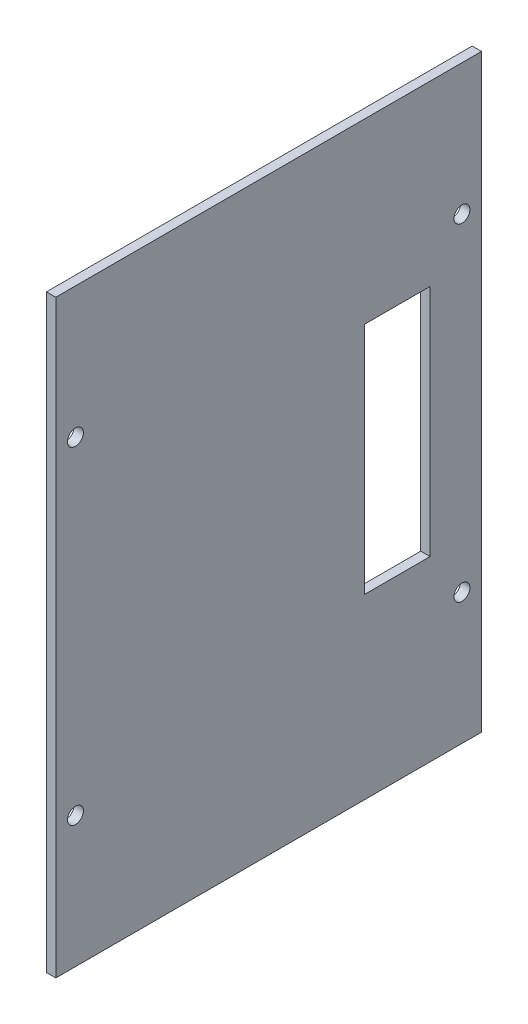
ISO-10303-21;
HEADER;
FILE_DESCRIPTION(('STEP AP214'),'2;1');
FILE_NAME('part.step','',(''),(''),'','','');
FILE_SCHEMA(('AUTOMOTIVE_DESIGN { 1 0 10303 214 1 1 1 1 }'));
ENDSEC;
DATA;
#1=APPLICATION_CONTEXT('core data for automotive mechanical design processes');
#2=APPLICATION_PROTOCOL_DEFINITION('international standard','automotive_design',2000,#1);
#3=PRODUCT_CONTEXT('',#1,'mechanical');
#4=PRODUCT('Part','Part','',(#3));
#5=PRODUCT_RELATED_PRODUCT_CATEGORY('part','',(#4));
#6=PRODUCT_DEFINITION_FORMATION('','',#4);
#7=PRODUCT_DEFINITION_CONTEXT('part definition',#1,'design');
#8=PRODUCT_DEFINITION('design','',#6,#7);
#9=PRODUCT_DEFINITION_SHAPE('','',#8);
#10=(LENGTH_UNIT() NAMED_UNIT(*) SI_UNIT(.MILLI.,.METRE.));
#11=(NAMED_UNIT(*) PLANE_ANGLE_UNIT() SI_UNIT($,.RADIAN.));
#12=(NAMED_UNIT(*) SI_UNIT($,.STERADIAN.) SOLID_ANGLE_UNIT());
#13=UNCERTAINTY_MEASURE_WITH_UNIT(LENGTH_MEASURE(1.E-05),#10,'distance_accuracy_value','');
#14=(GEOMETRIC_REPRESENTATION_CONTEXT(3) GLOBAL_UNCERTAINTY_ASSIGNED_CONTEXT((#13)) GLOBAL_UNIT_ASSIGNED_CONTEXT((#10,
#11,#12)) REPRESENTATION_CONTEXT('',''));
#15=CARTESIAN_POINT('',(0.,0.,0.));
#16=DIRECTION('',(0.,0.,1.));
#17=DIRECTION('',(1.,0.,0.));
#18=AXIS2_PLACEMENT_3D('',#15,#16,#17);
#19=CARTESIAN_POINT('',(-16.,-63.,0.));
#20=DIRECTION('',(1.,0.,0.));
#21=DIRECTION('',(0.,1.,0.));
#22=AXIS2_PLACEMENT_3D('',#19,#20,#21);
#23=PLANE('',#22);
#24=CARTESIAN_POINT('',(-16.,-35.,86.8));
#25=DIRECTION('',(-1.,0.,0.));
#26=DIRECTION('',(0.,0.,1.));
#27=AXIS2_PLACEMENT_3D('',#24,#25,#26);
#28=CIRCLE('',#27,1.7);
#29=CARTESIAN_POINT('',(-16.,-35.,88.5));
#30=VERTEX_POINT('',#29);
#31=EDGE_CURVE('E9',#30,#30,#28,.T.);
#32=ORIENTED_EDGE('',*,*,#31,.T.);
#33=EDGE_LOOP('',(#32));
#34=FACE_BOUND('',#33,.T.);
#35=CARTESIAN_POINT('',(-16.,-35.,4.2));
#36=DIRECTION('',(-1.,0.,0.));
#37=DIRECTION('',(0.,0.,1.));
#38=AXIS2_PLACEMENT_3D('',#35,#36,#37);
#39=CIRCLE('',#38,1.7);
#40=CARTESIAN_POINT('',(-16.,-35.,5.9));
#41=VERTEX_POINT('',#40);
#42=EDGE_CURVE('E150',#41,#41,#39,.T.);
#43=ORIENTED_EDGE('',*,*,#42,.T.);
#44=EDGE_LOOP('',(#43));
#45=FACE_BOUND('',#44,.T.);
#46=DIRECTION('',(0.,-1.,0.));
#47=VECTOR('',#46,1.);
#48=CARTESIAN_POINT('',(-16.,-44.,11.));
#49=LINE('',#48,#47);
#50=CARTESIAN_POINT('',(-16.,25.,11.));
#51=VERTEX_POINT('',#50);
#52=CARTESIAN_POINT('',(-16.,-25.,11.));
#53=VERTEX_POINT('',#52);
#54=EDGE_CURVE('E141',#51,#53,#49,.T.);
#55=ORIENTED_EDGE('',*,*,#54,.T.);
#56=DIRECTION('',(0.,0.,1.));
#57=VECTOR('',#56,1.);
#58=CARTESIAN_POINT('',(-16.,-25.,5.5));
#59=LINE('',#58,#57);
#60=CARTESIAN_POINT('',(-16.,-25.,25.));
#61=VERTEX_POINT('',#60);
#62=EDGE_CURVE('E111',#53,#61,#59,.T.);
#63=ORIENTED_EDGE('',*,*,#62,.T.);
#64=DIRECTION('',(0.,-1.,0.));
#65=VECTOR('',#64,1.);
#66=CARTESIAN_POINT('',(-16.,-44.,25.));
#67=LINE('',#66,#65);
#68=CARTESIAN_POINT('',(-16.,25.,25.));
#69=VERTEX_POINT('',#68);
#70=EDGE_CURVE('E116',#69,#61,#67,.T.);
#71=ORIENTED_EDGE('',*,*,#70,.F.);
#72=DIRECTION('',(0.,0.,1.));
#73=VECTOR('',#72,1.);
#74=CARTESIAN_POINT('',(-16.,25.,5.5));
#75=LINE('',#74,#73);
#76=EDGE_CURVE('E120',#51,#69,#75,.T.);
#77=ORIENTED_EDGE('',*,*,#76,.F.);
#78=EDGE_LOOP('',(#55,#63,#71,#77));
#79=FACE_BOUND('',#78,.T.);
#80=CARTESIAN_POINT('',(-16.,35.,86.8));
#81=DIRECTION('',(-1.,0.,0.));
#82=DIRECTION('',(0.,0.,1.));
#83=AXIS2_PLACEMENT_3D('',#80,#81,#82);
#84=CIRCLE('',#83,1.7);
#85=CARTESIAN_POINT('',(-16.,35.,88.5));
#86=VERTEX_POINT('',#85);
#87=EDGE_CURVE('E208',#86,#86,#84,.T.);
#88=ORIENTED_EDGE('',*,*,#87,.T.);
#89=EDGE_LOOP('',(#88));
#90=FACE_BOUND('',#89,.T.);
#91=CARTESIAN_POINT('',(-16.,35.,4.2));
#92=DIRECTION('',(-1.,0.,0.));
#93=DIRECTION('',(0.,0.,1.));
#94=AXIS2_PLACEMENT_3D('',#91,#92,#93);
#95=CIRCLE('',#94,1.7);
#96=CARTESIAN_POINT('',(-16.,35.,5.9));
#97=VERTEX_POINT('',#96);
#98=EDGE_CURVE('E162',#97,#97,#95,.T.);
#99=ORIENTED_EDGE('',*,*,#98,.T.);
#100=EDGE_LOOP('',(#99));
#101=FACE_BOUND('',#100,.T.);
#102=DIRECTION('',(0.,0.,1.));
#103=VECTOR('',#102,1.);
#104=CARTESIAN_POINT('',(-16.,-63.,0.));
#105=LINE('',#104,#103);
#106=CARTESIAN_POINT('',(-16.,-63.,0.));
#107=VERTEX_POINT('',#106);
#108=CARTESIAN_POINT('',(-16.,-63.,91.));
#109=VERTEX_POINT('',#108);
#110=EDGE_CURVE('E180',#107,#109,#105,.T.);
#111=ORIENTED_EDGE('',*,*,#110,.F.);
#112=DIRECTION('',(0.,1.,0.));
#113=VECTOR('',#112,1.);
#114=CARTESIAN_POINT('',(-16.,-63.,0.));
#115=LINE('',#114,#113);
#116=CARTESIAN_POINT('',(-16.,63.,0.));
#117=VERTEX_POINT('',#116);
#118=EDGE_CURVE('E216',#107,#117,#115,.T.);
#119=ORIENTED_EDGE('',*,*,#118,.T.);
#120=DIRECTION('',(0.,0.,1.));
#121=VECTOR('',#120,1.);
#122=CARTESIAN_POINT('',(-16.,63.,0.));
#123=LINE('',#122,#121);
#124=CARTESIAN_POINT('',(-16.,63.,91.));
#125=VERTEX_POINT('',#124);
#126=EDGE_CURVE('E18',#117,#125,#123,.T.);
#127=ORIENTED_EDGE('',*,*,#126,.T.);
#128=DIRECTION('',(0.,1.,0.));
#129=VECTOR('',#128,1.);
#130=CARTESIAN_POINT('',(-16.,-63.,91.));
#131=LINE('',#130,#129);
#132=EDGE_CURVE('E187',#109,#125,#131,.T.);
#133=ORIENTED_EDGE('',*,*,#132,.F.);
#134=EDGE_LOOP('',(#111,#119,#127,#133));
#135=FACE_BOUND('',#134,.T.);
#136=ADVANCED_FACE('F14',(#34,#45,#79,#90,#101,#135),#23,.T.);
#137=CARTESIAN_POINT('',(-15.99,-35.,86.8));
#138=DIRECTION('',(-1.,0.,0.));
#139=DIRECTION('',(0.,0.,1.));
#140=AXIS2_PLACEMENT_3D('',#137,#138,#139);
#141=CYLINDRICAL_SURFACE('',#140,1.7);
#142=DIRECTION('',(-1.,0.,0.));
#143=VECTOR('',#142,1.);
#144=CARTESIAN_POINT('',(-15.99,-35.,88.5));
#145=LINE('',#144,#143);
#146=CARTESIAN_POINT('',(-18.,-35.,88.5));
#147=VERTEX_POINT('',#146);
#148=EDGE_CURVE('E25',#30,#147,#145,.T.);
#149=ORIENTED_EDGE('',*,*,#148,.F.);
#150=ORIENTED_EDGE('',*,*,#31,.F.);
#151=ORIENTED_EDGE('',*,*,#148,.T.);
#152=CARTESIAN_POINT('',(-18.,-35.,86.8));
#153=DIRECTION('',(-1.,0.,0.));
#154=DIRECTION('',(0.,0.,1.));
#155=AXIS2_PLACEMENT_3D('',#152,#153,#154);
#156=CIRCLE('',#155,1.7);
#157=EDGE_CURVE('E156',#147,#147,#156,.T.);
#158=ORIENTED_EDGE('',*,*,#157,.T.);
#159=EDGE_LOOP('',(#149,#150,#151,#158));
#160=FACE_BOUND('',#159,.T.);
#161=ADVANCED_FACE('F16',(#160),#141,.F.);
#162=CARTESIAN_POINT('',(-15.99,-35.,4.2));
#163=DIRECTION('',(-1.,0.,0.));
#164=DIRECTION('',(0.,0.,1.));
#165=AXIS2_PLACEMENT_3D('',#162,#163,#164);
#166=CYLINDRICAL_SURFACE('',#165,1.7);
#167=DIRECTION('',(-1.,0.,0.));
#168=VECTOR('',#167,1.);
#169=CARTESIAN_POINT('',(-15.99,-35.,5.9));
#170=LINE('',#169,#168);
#171=CARTESIAN_POINT('',(-18.,-35.,5.9));
#172=VERTEX_POINT('',#171);
#173=EDGE_CURVE('E53',#41,#172,#170,.T.);
#174=ORIENTED_EDGE('',*,*,#173,.F.);
#175=ORIENTED_EDGE('',*,*,#42,.F.);
#176=ORIENTED_EDGE('',*,*,#173,.T.);
#177=CARTESIAN_POINT('',(-18.,-35.,4.2));
#178=DIRECTION('',(-1.,0.,0.));
#179=DIRECTION('',(0.,0.,1.));
#180=AXIS2_PLACEMENT_3D('',#177,#178,#179);
#181=CIRCLE('',#180,1.7);
#182=EDGE_CURVE('E153',#172,#172,#181,.T.);
#183=ORIENTED_EDGE('',*,*,#182,.T.);
#184=EDGE_LOOP('',(#174,#175,#176,#183));
#185=FACE_BOUND('',#184,.T.);
#186=ADVANCED_FACE('F295',(#185),#166,.F.);
#187=CARTESIAN_POINT('',(-19.,-25.,11.));
#188=DIRECTION('',(0.,1.,0.));
#189=DIRECTION('',(1.,0.,0.));
#190=AXIS2_PLACEMENT_3D('',#187,#188,#189);
#191=PLANE('',#190);
#192=DIRECTION('',(1.,0.,0.));
#193=VECTOR('',#192,1.);
#194=CARTESIAN_POINT('',(-19.,-25.,11.));
#195=LINE('',#194,#193);
#196=CARTESIAN_POINT('',(-18.,-25.,11.));
#197=VERTEX_POINT('',#196);
#198=EDGE_CURVE('E69',#197,#53,#195,.T.);
#199=ORIENTED_EDGE('',*,*,#198,.F.);
#200=DIRECTION('',(0.,0.,1.));
#201=VECTOR('',#200,1.);
#202=CARTESIAN_POINT('',(-18.,-25.,5.5));
#203=LINE('',#202,#201);
#204=CARTESIAN_POINT('',(-18.,-25.,25.));
#205=VERTEX_POINT('',#204);
#206=EDGE_CURVE('E165',#197,#205,#203,.T.);
#207=ORIENTED_EDGE('',*,*,#206,.T.);
#208=DIRECTION('',(1.,0.,0.));
#209=VECTOR('',#208,1.);
#210=CARTESIAN_POINT('',(-19.,-25.,25.));
#211=LINE('',#210,#209);
#212=EDGE_CURVE('E124',#205,#61,#211,.T.);
#213=ORIENTED_EDGE('',*,*,#212,.T.);
#214=ORIENTED_EDGE('',*,*,#62,.F.);
#215=EDGE_LOOP('',(#199,#207,#213,#214));
#216=FACE_BOUND('',#215,.T.);
#217=ADVANCED_FACE('F309',(#216),#191,.T.);
#218=CARTESIAN_POINT('',(-19.,-25.,25.));
#219=DIRECTION('',(0.,0.,1.));
#220=DIRECTION('',(1.,0.,0.));
#221=AXIS2_PLACEMENT_3D('',#218,#219,#220);
#222=PLANE('',#221);
#223=ORIENTED_EDGE('',*,*,#70,.T.);
#224=ORIENTED_EDGE('',*,*,#212,.F.);
#225=DIRECTION('',(0.,-1.,0.));
#226=VECTOR('',#225,1.);
#227=CARTESIAN_POINT('',(-18.,-44.,25.));
#228=LINE('',#227,#226);
#229=CARTESIAN_POINT('',(-18.,25.,25.));
#230=VERTEX_POINT('',#229);
#231=EDGE_CURVE('E130',#230,#205,#228,.T.);
#232=ORIENTED_EDGE('',*,*,#231,.F.);
#233=DIRECTION('',(1.,0.,0.));
#234=VECTOR('',#233,1.);
#235=CARTESIAN_POINT('',(-19.,25.,25.));
#236=LINE('',#235,#234);
#237=EDGE_CURVE('E125',#230,#69,#236,.T.);
#238=ORIENTED_EDGE('',*,*,#237,.T.);
#239=EDGE_LOOP('',(#223,#224,#232,#238));
#240=FACE_BOUND('',#239,.T.);
#241=ADVANCED_FACE('F128',(#240),#222,.F.);
#242=CARTESIAN_POINT('',(-19.,25.,11.));
#243=DIRECTION('',(0.,1.,0.));
#244=DIRECTION('',(1.,0.,0.));
#245=AXIS2_PLACEMENT_3D('',#242,#243,#244);
#246=PLANE('',#245);
#247=ORIENTED_EDGE('',*,*,#76,.T.);
#248=ORIENTED_EDGE('',*,*,#237,.F.);
#249=DIRECTION('',(0.,0.,1.));
#250=VECTOR('',#249,1.);
#251=CARTESIAN_POINT('',(-18.,25.,5.5));
#252=LINE('',#251,#250);
#253=CARTESIAN_POINT('',(-18.,25.,11.));
#254=VERTEX_POINT('',#253);
#255=EDGE_CURVE('E166',#254,#230,#252,.T.);
#256=ORIENTED_EDGE('',*,*,#255,.F.);
#257=DIRECTION('',(1.,0.,0.));
#258=VECTOR('',#257,1.);
#259=CARTESIAN_POINT('',(-19.,25.,11.));
#260=LINE('',#259,#258);
#261=EDGE_CURVE('E139',#254,#51,#260,.T.);
#262=ORIENTED_EDGE('',*,*,#261,.T.);
#263=EDGE_LOOP('',(#247,#248,#256,#262));
#264=FACE_BOUND('',#263,.T.);
#265=ADVANCED_FACE('F137',(#264),#246,.F.);
#266=CARTESIAN_POINT('',(-19.,-25.,11.));
#267=DIRECTION('',(0.,0.,1.));
#268=DIRECTION('',(1.,0.,0.));
#269=AXIS2_PLACEMENT_3D('',#266,#267,#268);
#270=PLANE('',#269);
#271=ORIENTED_EDGE('',*,*,#261,.F.);
#272=DIRECTION('',(0.,-1.,0.));
#273=VECTOR('',#272,1.);
#274=CARTESIAN_POINT('',(-18.,-44.,11.));
#275=LINE('',#274,#273);
#276=EDGE_CURVE('E157',#254,#197,#275,.T.);
#277=ORIENTED_EDGE('',*,*,#276,.T.);
#278=ORIENTED_EDGE('',*,*,#198,.T.);
#279=ORIENTED_EDGE('',*,*,#54,.F.);
#280=EDGE_LOOP('',(#271,#277,#278,#279));
#281=FACE_BOUND('',#280,.T.);
#282=ADVANCED_FACE('F239',(#281),#270,.T.);
#283=CARTESIAN_POINT('',(-15.99,35.,86.8));
#284=DIRECTION('',(-1.,0.,0.));
#285=DIRECTION('',(0.,0.,1.));
#286=AXIS2_PLACEMENT_3D('',#283,#284,#285);
#287=CYLINDRICAL_SURFACE('',#286,1.7);
#288=DIRECTION('',(-1.,0.,0.));
#289=VECTOR('',#288,1.);
#290=CARTESIAN_POINT('',(-15.99,35.,88.5));
#291=LINE('',#290,#289);
#292=CARTESIAN_POINT('',(-18.,35.,88.5));
#293=VERTEX_POINT('',#292);
#294=EDGE_CURVE('E211',#86,#293,#291,.T.);
#295=ORIENTED_EDGE('',*,*,#294,.F.);
#296=ORIENTED_EDGE('',*,*,#87,.F.);
#297=ORIENTED_EDGE('',*,*,#294,.T.);
#298=CARTESIAN_POINT('',(-18.,35.,86.8));
#299=DIRECTION('',(-1.,0.,0.));
#300=DIRECTION('',(0.,0.,1.));
#301=AXIS2_PLACEMENT_3D('',#298,#299,#300);
#302=CIRCLE('',#301,1.7);
#303=EDGE_CURVE('E179',#293,#293,#302,.T.);
#304=ORIENTED_EDGE('',*,*,#303,.T.);
#305=EDGE_LOOP('',(#295,#296,#297,#304));
#306=FACE_BOUND('',#305,.T.);
#307=ADVANCED_FACE('F307',(#306),#287,.F.);
#308=CARTESIAN_POINT('',(-15.99,35.,4.2));
#309=DIRECTION('',(-1.,0.,0.));
#310=DIRECTION('',(0.,0.,1.));
#311=AXIS2_PLACEMENT_3D('',#308,#309,#310);
#312=CYLINDRICAL_SURFACE('',#311,1.7);
#313=DIRECTION('',(-1.,0.,0.));
#314=VECTOR('',#313,1.);
#315=CARTESIAN_POINT('',(-15.99,35.,5.9));
#316=LINE('',#315,#314);
#317=CARTESIAN_POINT('',(-18.,35.,5.9));
#318=VERTEX_POINT('',#317);
#319=EDGE_CURVE('E158',#97,#318,#316,.T.);
#320=ORIENTED_EDGE('',*,*,#319,.F.);
#321=ORIENTED_EDGE('',*,*,#98,.F.);
#322=ORIENTED_EDGE('',*,*,#319,.T.);
#323=CARTESIAN_POINT('',(-18.,35.,4.2));
#324=DIRECTION('',(-1.,0.,0.));
#325=DIRECTION('',(0.,0.,1.));
#326=AXIS2_PLACEMENT_3D('',#323,#324,#325);
#327=CIRCLE('',#326,1.7);
#328=EDGE_CURVE('E175',#318,#318,#327,.T.);
#329=ORIENTED_EDGE('',*,*,#328,.T.);
#330=EDGE_LOOP('',(#320,#321,#322,#329));
#331=FACE_BOUND('',#330,.T.);
#332=ADVANCED_FACE('F304',(#331),#312,.F.);
#333=CARTESIAN_POINT('',(-18.,63.,0.));
#334=DIRECTION('',(0.,1.,0.));
#335=DIRECTION('',(1.,0.,0.));
#336=AXIS2_PLACEMENT_3D('',#333,#334,#335);
#337=PLANE('',#336);
#338=DIRECTION('',(1.,0.,0.));
#339=VECTOR('',#338,1.);
#340=CARTESIAN_POINT('',(-18.,63.,0.));
#341=LINE('',#340,#339);
#342=CARTESIAN_POINT('',(-18.,63.,0.));
#343=VERTEX_POINT('',#342);
#344=EDGE_CURVE('E212',#343,#117,#341,.T.);
#345=ORIENTED_EDGE('',*,*,#344,.F.);
#346=DIRECTION('',(0.,0.,1.));
#347=VECTOR('',#346,1.);
#348=CARTESIAN_POINT('',(-18.,63.,0.));
#349=LINE('',#348,#347);
#350=CARTESIAN_POINT('',(-18.,63.,91.));
#351=VERTEX_POINT('',#350);
#352=EDGE_CURVE('E172',#343,#351,#349,.T.);
#353=ORIENTED_EDGE('',*,*,#352,.T.);
#354=DIRECTION('',(1.,0.,0.));
#355=VECTOR('',#354,1.);
#356=CARTESIAN_POINT('',(-18.,63.,91.));
#357=LINE('',#356,#355);
#358=EDGE_CURVE('E197',#351,#125,#357,.T.);
#359=ORIENTED_EDGE('',*,*,#358,.T.);
#360=ORIENTED_EDGE('',*,*,#126,.F.);
#361=EDGE_LOOP('',(#345,#353,#359,#360));
#362=FACE_BOUND('',#361,.T.);
#363=ADVANCED_FACE('F272',(#362),#337,.T.);
#364=CARTESIAN_POINT('',(-18.,-63.,0.));
#365=DIRECTION('',(0.,0.,1.));
#366=DIRECTION('',(1.,0.,0.));
#367=AXIS2_PLACEMENT_3D('',#364,#365,#366);
#368=PLANE('',#367);
#369=ORIENTED_EDGE('',*,*,#344,.T.);
#370=ORIENTED_EDGE('',*,*,#118,.F.);
#371=DIRECTION('',(1.,0.,0.));
#372=VECTOR('',#371,1.);
#373=CARTESIAN_POINT('',(-18.,-63.,0.));
#374=LINE('',#373,#372);
#375=CARTESIAN_POINT('',(-18.,-63.,0.));
#376=VERTEX_POINT('',#375);
#377=EDGE_CURVE('E184',#376,#107,#374,.T.);
#378=ORIENTED_EDGE('',*,*,#377,.F.);
#379=DIRECTION('',(0.,1.,0.));
#380=VECTOR('',#379,1.);
#381=CARTESIAN_POINT('',(-18.,-63.,0.));
#382=LINE('',#381,#380);
#383=EDGE_CURVE('E167',#376,#343,#382,.T.);
#384=ORIENTED_EDGE('',*,*,#383,.T.);
#385=EDGE_LOOP('',(#369,#370,#378,#384));
#386=FACE_BOUND('',#385,.T.);
#387=ADVANCED_FACE('F279',(#386),#368,.F.);
#388=CARTESIAN_POINT('',(-18.,-63.,91.));
#389=DIRECTION('',(0.,0.,1.));
#390=DIRECTION('',(1.,0.,0.));
#391=AXIS2_PLACEMENT_3D('',#388,#389,#390);
#392=PLANE('',#391);
#393=DIRECTION('',(0.,1.,0.));
#394=VECTOR('',#393,1.);
#395=CARTESIAN_POINT('',(-18.,-63.,91.));
#396=LINE('',#395,#394);
#397=CARTESIAN_POINT('',(-18.,-63.,91.));
#398=VERTEX_POINT('',#397);
#399=EDGE_CURVE('E250',#398,#351,#396,.T.);
#400=ORIENTED_EDGE('',*,*,#399,.F.);
#401=DIRECTION('',(1.,0.,0.));
#402=VECTOR('',#401,1.);
#403=CARTESIAN_POINT('',(-18.,-63.,91.));
#404=LINE('',#403,#402);
#405=EDGE_CURVE('E183',#398,#109,#404,.T.);
#406=ORIENTED_EDGE('',*,*,#405,.T.);
#407=ORIENTED_EDGE('',*,*,#132,.T.);
#408=ORIENTED_EDGE('',*,*,#358,.F.);
#409=EDGE_LOOP('',(#400,#406,#407,#408));
#410=FACE_BOUND('',#409,.T.);
#411=ADVANCED_FACE('F275',(#410),#392,.T.);
#412=CARTESIAN_POINT('',(-18.,-63.,0.));
#413=DIRECTION('',(0.,1.,0.));
#414=DIRECTION('',(1.,0.,0.));
#415=AXIS2_PLACEMENT_3D('',#412,#413,#414);
#416=PLANE('',#415);
#417=ORIENTED_EDGE('',*,*,#110,.T.);
#418=ORIENTED_EDGE('',*,*,#405,.F.);
#419=DIRECTION('',(0.,0.,1.));
#420=VECTOR('',#419,1.);
#421=CARTESIAN_POINT('',(-18.,-63.,0.));
#422=LINE('',#421,#420);
#423=EDGE_CURVE('E171',#376,#398,#422,.T.);
#424=ORIENTED_EDGE('',*,*,#423,.F.);
#425=ORIENTED_EDGE('',*,*,#377,.T.);
#426=EDGE_LOOP('',(#417,#418,#424,#425));
#427=FACE_BOUND('',#426,.T.);
#428=ADVANCED_FACE('F278',(#427),#416,.F.);
#429=CARTESIAN_POINT('',(-18.,-63.,0.));
#430=DIRECTION('',(1.,0.,0.));
#431=DIRECTION('',(0.,1.,0.));
#432=AXIS2_PLACEMENT_3D('',#429,#430,#431);
#433=PLANE('',#432);
#434=ORIENTED_EDGE('',*,*,#157,.F.);
#435=EDGE_LOOP('',(#434));
#436=FACE_BOUND('',#435,.T.);
#437=ORIENTED_EDGE('',*,*,#182,.F.);
#438=EDGE_LOOP('',(#437));
#439=FACE_BOUND('',#438,.T.);
#440=ORIENTED_EDGE('',*,*,#255,.T.);
#441=ORIENTED_EDGE('',*,*,#231,.T.);
#442=ORIENTED_EDGE('',*,*,#206,.F.);
#443=ORIENTED_EDGE('',*,*,#276,.F.);
#444=EDGE_LOOP('',(#440,#441,#442,#443));
#445=FACE_BOUND('',#444,.T.);
#446=ORIENTED_EDGE('',*,*,#303,.F.);
#447=EDGE_LOOP('',(#446));
#448=FACE_BOUND('',#447,.T.);
#449=ORIENTED_EDGE('',*,*,#328,.F.);
#450=EDGE_LOOP('',(#449));
#451=FACE_BOUND('',#450,.T.);
#452=ORIENTED_EDGE('',*,*,#399,.T.);
#453=ORIENTED_EDGE('',*,*,#352,.F.);
#454=ORIENTED_EDGE('',*,*,#383,.F.);
#455=ORIENTED_EDGE('',*,*,#423,.T.);
#456=EDGE_LOOP('',(#452,#453,#454,#455));
#457=FACE_BOUND('',#456,.T.);
#458=ADVANCED_FACE('F233',(#436,#439,#445,#448,#451,#457),#433,.F.);
#459=CLOSED_SHELL('',(#136,#161,#186,#217,#241,#265,#282,#307,#332,#363,#387,#411,#428,#458));
#460=MANIFOLD_SOLID_BREP('B1',#459);
#461=ADVANCED_BREP_SHAPE_REPRESENTATION('',(#18,#460),#14);
#462=SHAPE_DEFINITION_REPRESENTATION(#9,#461);
ENDSEC;
END-ISO-10303-21;
